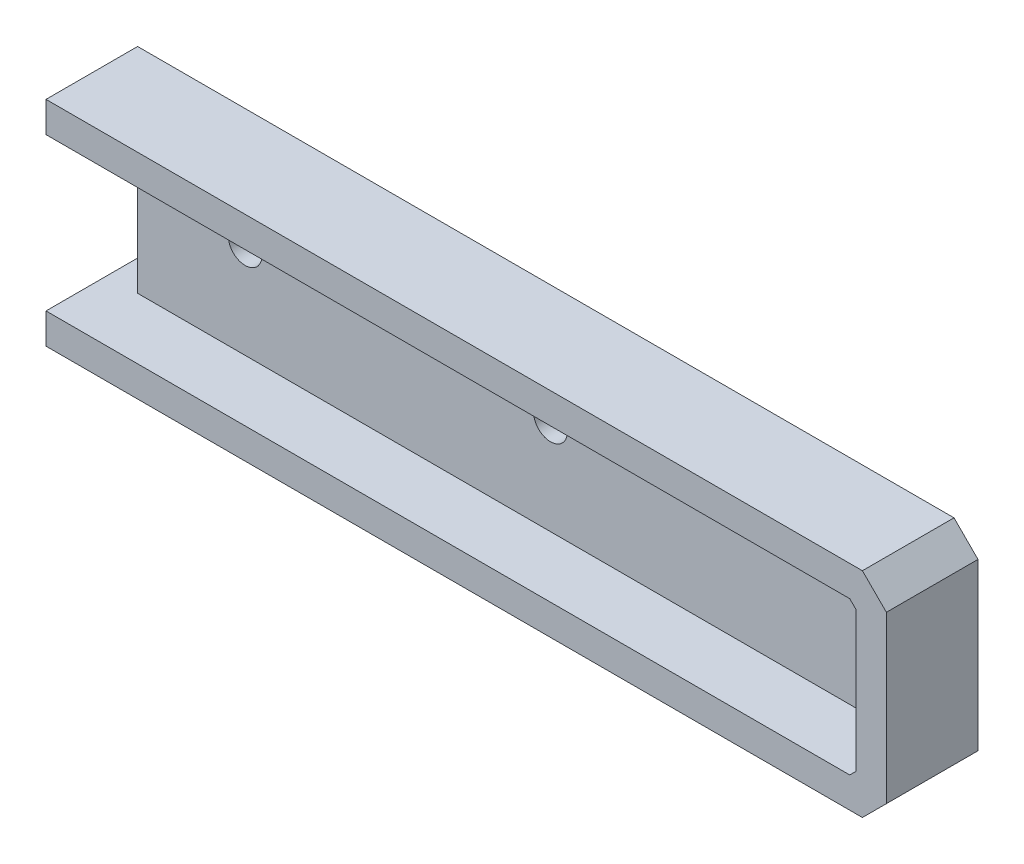
ISO-10303-21;
HEADER;
FILE_DESCRIPTION(('STEP AP214'),'2;1');
FILE_NAME('part.step','',(''),(''),'','','');
FILE_SCHEMA(('AUTOMOTIVE_DESIGN { 1 0 10303 214 1 1 1 1 }'));
ENDSEC;
DATA;
#1=APPLICATION_CONTEXT('core data for automotive mechanical design processes');
#2=APPLICATION_PROTOCOL_DEFINITION('international standard','automotive_design',2000,#1);
#3=PRODUCT_CONTEXT('',#1,'mechanical');
#4=PRODUCT('Part','Part','',(#3));
#5=PRODUCT_RELATED_PRODUCT_CATEGORY('part','',(#4));
#6=PRODUCT_DEFINITION_FORMATION('','',#4);
#7=PRODUCT_DEFINITION_CONTEXT('part definition',#1,'design');
#8=PRODUCT_DEFINITION('design','',#6,#7);
#9=PRODUCT_DEFINITION_SHAPE('','',#8);
#10=(LENGTH_UNIT() NAMED_UNIT(*) SI_UNIT(.MILLI.,.METRE.));
#11=(NAMED_UNIT(*) PLANE_ANGLE_UNIT() SI_UNIT($,.RADIAN.));
#12=(NAMED_UNIT(*) SI_UNIT($,.STERADIAN.) SOLID_ANGLE_UNIT());
#13=UNCERTAINTY_MEASURE_WITH_UNIT(LENGTH_MEASURE(1.E-05),#10,'distance_accuracy_value','');
#14=(GEOMETRIC_REPRESENTATION_CONTEXT(3) GLOBAL_UNCERTAINTY_ASSIGNED_CONTEXT((#13)) GLOBAL_UNIT_ASSIGNED_CONTEXT((#10,
#11,#12)) REPRESENTATION_CONTEXT('',''));
#15=CARTESIAN_POINT('',(0.,0.,0.));
#16=DIRECTION('',(0.,0.,1.));
#17=DIRECTION('',(1.,0.,0.));
#18=AXIS2_PLACEMENT_3D('',#15,#16,#17);
#19=CARTESIAN_POINT('',(0.,0.,5.));
#20=DIRECTION('',(0.,0.,-1.));
#21=DIRECTION('',(-1.,0.,0.));
#22=AXIS2_PLACEMENT_3D('',#19,#20,#21);
#23=PLANE('',#22);
#24=DIRECTION('',(-1.,0.,0.));
#25=VECTOR('',#24,1.);
#26=CARTESIAN_POINT('',(72.3909080624026,0.,5.));
#27=LINE('',#26,#25);
#28=CARTESIAN_POINT('',(199.,0.,5.));
#29=VERTEX_POINT('',#28);
#30=CARTESIAN_POINT('',(72.3909080624026,0.,5.));
#31=VERTEX_POINT('',#30);
#32=EDGE_CURVE('E245',#29,#31,#27,.T.);
#33=ORIENTED_EDGE('',*,*,#32,.T.);
#34=DIRECTION('',(0.,-1.,0.));
#35=VECTOR('',#34,1.);
#36=CARTESIAN_POINT('',(72.3909080624026,0.,5.));
#37=LINE('',#36,#35);
#38=CARTESIAN_POINT('',(72.3909080624026,-25.,5.));
#39=VERTEX_POINT('',#38);
#40=EDGE_CURVE('E247',#31,#39,#37,.T.);
#41=ORIENTED_EDGE('',*,*,#40,.T.);
#42=DIRECTION('',(1.,0.,0.));
#43=VECTOR('',#42,1.);
#44=CARTESIAN_POINT('',(195.,-25.,5.));
#45=LINE('',#44,#43);
#46=CARTESIAN_POINT('',(199.,-25.,5.));
#47=VERTEX_POINT('',#46);
#48=EDGE_CURVE('E249',#39,#47,#45,.T.);
#49=ORIENTED_EDGE('',*,*,#48,.T.);
#50=DIRECTION('',(0.707106781186547,0.707106781186547,0.));
#51=VECTOR('',#50,1.);
#52=CARTESIAN_POINT('',(199.,-25.,5.));
#53=LINE('',#52,#51);
#54=CARTESIAN_POINT('',(200.,-24.,5.));
#55=VERTEX_POINT('',#54);
#56=EDGE_CURVE('E148',#47,#55,#53,.T.);
#57=ORIENTED_EDGE('',*,*,#56,.T.);
#58=DIRECTION('',(0.,1.,0.));
#59=VECTOR('',#58,1.);
#60=CARTESIAN_POINT('',(200.,-1.00000000000004,5.));
#61=LINE('',#60,#59);
#62=CARTESIAN_POINT('',(200.,-1.00000000000004,5.));
#63=VERTEX_POINT('',#62);
#64=EDGE_CURVE('E252',#55,#63,#61,.T.);
#65=ORIENTED_EDGE('',*,*,#64,.T.);
#66=DIRECTION('',(-0.707106781186547,0.707106781186548,0.));
#67=VECTOR('',#66,1.);
#68=CARTESIAN_POINT('',(199.,0.,5.));
#69=LINE('',#68,#67);
#70=EDGE_CURVE('E49',#63,#29,#69,.T.);
#71=ORIENTED_EDGE('',*,*,#70,.T.);
#72=EDGE_LOOP('',(#33,#41,#49,#57,#65,#71));
#73=FACE_BOUND('',#72,.T.);
#74=CARTESIAN_POINT('',(90.0000000000027,-9.49999999999997,5.));
#75=DIRECTION('',(0.,0.,1.));
#76=DIRECTION('',(-1.,0.,0.));
#77=AXIS2_PLACEMENT_3D('',#74,#75,#76);
#78=CIRCLE('',#77,2.75000000000001);
#79=CARTESIAN_POINT('',(87.2500000000027,-9.49999999999997,5.));
#80=VERTEX_POINT('',#79);
#81=EDGE_CURVE('E239',#80,#80,#78,.T.);
#82=ORIENTED_EDGE('',*,*,#81,.F.);
#83=EDGE_LOOP('',(#82));
#84=FACE_BOUND('',#83,.T.);
#85=CARTESIAN_POINT('',(140.,-9.49999999999997,5.));
#86=DIRECTION('',(0.,0.,1.));
#87=DIRECTION('',(-1.,0.,0.));
#88=AXIS2_PLACEMENT_3D('',#85,#86,#87);
#89=CIRCLE('',#88,2.75000000000001);
#90=CARTESIAN_POINT('',(137.25,-9.49999999999997,5.));
#91=VERTEX_POINT('',#90);
#92=EDGE_CURVE('E233',#91,#91,#89,.T.);
#93=ORIENTED_EDGE('',*,*,#92,.F.);
#94=EDGE_LOOP('',(#93));
#95=FACE_BOUND('',#94,.T.);
#96=ADVANCED_FACE('F33',(#73,#84,#95),#23,.F.);
#97=CARTESIAN_POINT('',(0.,0.,0.));
#98=DIRECTION('',(0.,0.,-1.));
#99=DIRECTION('',(-1.,0.,0.));
#100=AXIS2_PLACEMENT_3D('',#97,#98,#99);
#101=PLANE('',#100);
#102=CARTESIAN_POINT('',(90.0000000000027,-9.49999999999997,0.));
#103=DIRECTION('',(0.,0.,1.));
#104=DIRECTION('',(-1.,0.,0.));
#105=AXIS2_PLACEMENT_3D('',#102,#103,#104);
#106=CIRCLE('',#105,2.75000000000001);
#107=CARTESIAN_POINT('',(87.2500000000027,-9.49999999999997,0.));
#108=VERTEX_POINT('',#107);
#109=EDGE_CURVE('E236',#108,#108,#106,.T.);
#110=ORIENTED_EDGE('',*,*,#109,.T.);
#111=EDGE_LOOP('',(#110));
#112=FACE_BOUND('',#111,.T.);
#113=DIRECTION('',(0.,-1.,0.));
#114=VECTOR('',#113,1.);
#115=CARTESIAN_POINT('',(72.3909080624026,0.,0.));
#116=LINE('',#115,#114);
#117=CARTESIAN_POINT('',(72.3909080624026,0.,0.));
#118=VERTEX_POINT('',#117);
#119=CARTESIAN_POINT('',(72.3909080624026,-25.,0.));
#120=VERTEX_POINT('',#119);
#121=EDGE_CURVE('E242',#118,#120,#116,.T.);
#122=ORIENTED_EDGE('',*,*,#121,.F.);
#123=DIRECTION('',(-1.,0.,0.));
#124=VECTOR('',#123,1.);
#125=CARTESIAN_POINT('',(72.3909080624026,0.,0.));
#126=LINE('',#125,#124);
#127=CARTESIAN_POINT('',(67.3909080624026,0.,0.));
#128=VERTEX_POINT('',#127);
#129=EDGE_CURVE('E187',#118,#128,#126,.T.);
#130=ORIENTED_EDGE('',*,*,#129,.T.);
#131=DIRECTION('',(0.,1.,0.));
#132=VECTOR('',#131,1.);
#133=CARTESIAN_POINT('',(67.3909080624026,0.,0.));
#134=LINE('',#133,#132);
#135=CARTESIAN_POINT('',(67.3909080624026,5.00000000000005,0.));
#136=VERTEX_POINT('',#135);
#137=EDGE_CURVE('E189',#128,#136,#134,.T.);
#138=ORIENTED_EDGE('',*,*,#137,.T.);
#139=DIRECTION('',(1.,0.,0.));
#140=VECTOR('',#139,1.);
#141=CARTESIAN_POINT('',(67.3909080624026,5.00000000000005,0.));
#142=LINE('',#141,#140);
#143=CARTESIAN_POINT('',(201.071067811865,5.00000000000002,0.));
#144=VERTEX_POINT('',#143);
#145=EDGE_CURVE('E192',#136,#144,#142,.T.);
#146=ORIENTED_EDGE('',*,*,#145,.T.);
#147=DIRECTION('',(0.707106781186547,-0.707106781186548,0.));
#148=VECTOR('',#147,1.);
#149=CARTESIAN_POINT('',(201.071067811865,5.00000000000002,0.));
#150=LINE('',#149,#148);
#151=CARTESIAN_POINT('',(205.,1.07106781186542,0.));
#152=VERTEX_POINT('',#151);
#153=EDGE_CURVE('E195',#144,#152,#150,.T.);
#154=ORIENTED_EDGE('',*,*,#153,.T.);
#155=DIRECTION('',(0.,-1.,0.));
#156=VECTOR('',#155,1.);
#157=CARTESIAN_POINT('',(205.,1.07106781186542,0.));
#158=LINE('',#157,#156);
#159=CARTESIAN_POINT('',(205.,-26.0710678118654,0.));
#160=VERTEX_POINT('',#159);
#161=EDGE_CURVE('E198',#152,#160,#158,.T.);
#162=ORIENTED_EDGE('',*,*,#161,.T.);
#163=DIRECTION('',(-0.707106781186547,-0.707106781186548,0.));
#164=VECTOR('',#163,1.);
#165=CARTESIAN_POINT('',(205.,-26.0710678118654,0.));
#166=LINE('',#165,#164);
#167=CARTESIAN_POINT('',(201.071067811865,-30.,0.));
#168=VERTEX_POINT('',#167);
#169=EDGE_CURVE('E201',#160,#168,#166,.T.);
#170=ORIENTED_EDGE('',*,*,#169,.T.);
#171=DIRECTION('',(-1.,0.,0.));
#172=VECTOR('',#171,1.);
#173=CARTESIAN_POINT('',(201.071067811865,-30.,0.));
#174=LINE('',#173,#172);
#175=CARTESIAN_POINT('',(67.3909080624026,-30.,0.));
#176=VERTEX_POINT('',#175);
#177=EDGE_CURVE('E204',#168,#176,#174,.T.);
#178=ORIENTED_EDGE('',*,*,#177,.T.);
#179=DIRECTION('',(0.,1.,0.));
#180=VECTOR('',#179,1.);
#181=CARTESIAN_POINT('',(67.3909080624026,-30.,0.));
#182=LINE('',#181,#180);
#183=CARTESIAN_POINT('',(67.3909080624026,-25.,0.));
#184=VERTEX_POINT('',#183);
#185=EDGE_CURVE('E141',#176,#184,#182,.T.);
#186=ORIENTED_EDGE('',*,*,#185,.T.);
#187=DIRECTION('',(1.,0.,0.));
#188=VECTOR('',#187,1.);
#189=CARTESIAN_POINT('',(199.,-25.,0.));
#190=LINE('',#189,#188);
#191=EDGE_CURVE('E184',#184,#120,#190,.T.);
#192=ORIENTED_EDGE('',*,*,#191,.T.);
#193=EDGE_LOOP('',(#122,#130,#138,#146,#154,#162,#170,#178,#186,#192));
#194=FACE_BOUND('',#193,.T.);
#195=CARTESIAN_POINT('',(140.,-9.49999999999997,0.));
#196=DIRECTION('',(0.,0.,1.));
#197=DIRECTION('',(-1.,0.,0.));
#198=AXIS2_PLACEMENT_3D('',#195,#196,#197);
#199=CIRCLE('',#198,2.75000000000001);
#200=CARTESIAN_POINT('',(137.25,-9.49999999999997,0.));
#201=VERTEX_POINT('',#200);
#202=EDGE_CURVE('E210',#201,#201,#199,.T.);
#203=ORIENTED_EDGE('',*,*,#202,.T.);
#204=EDGE_LOOP('',(#203));
#205=FACE_BOUND('',#204,.T.);
#206=ADVANCED_FACE('F261',(#112,#194,#205),#101,.T.);
#207=CARTESIAN_POINT('',(72.3909080624026,0.,5.));
#208=DIRECTION('',(1.,0.,0.));
#209=DIRECTION('',(0.,0.,-1.));
#210=AXIS2_PLACEMENT_3D('',#207,#208,#209);
#211=PLANE('',#210);
#212=ORIENTED_EDGE('',*,*,#121,.T.);
#213=DIRECTION('',(0.,0.,-1.));
#214=VECTOR('',#213,1.);
#215=CARTESIAN_POINT('',(72.3909080624026,-25.,5.));
#216=LINE('',#215,#214);
#217=EDGE_CURVE('E42',#39,#120,#216,.T.);
#218=ORIENTED_EDGE('',*,*,#217,.F.);
#219=ORIENTED_EDGE('',*,*,#40,.F.);
#220=DIRECTION('',(0.,0.,-1.));
#221=VECTOR('',#220,1.);
#222=CARTESIAN_POINT('',(72.3909080624026,0.,5.));
#223=LINE('',#222,#221);
#224=EDGE_CURVE('E11',#31,#118,#223,.T.);
#225=ORIENTED_EDGE('',*,*,#224,.T.);
#226=EDGE_LOOP('',(#212,#218,#219,#225));
#227=FACE_BOUND('',#226,.T.);
#228=ADVANCED_FACE('F35',(#227),#211,.F.);
#229=CARTESIAN_POINT('',(90.0000000000027,-9.49999999999997,5.));
#230=DIRECTION('',(0.,0.,-1.));
#231=DIRECTION('',(-1.,0.,0.));
#232=AXIS2_PLACEMENT_3D('',#229,#230,#231);
#233=CYLINDRICAL_SURFACE('',#232,2.75000000000001);
#234=ORIENTED_EDGE('',*,*,#81,.T.);
#235=EDGE_LOOP('',(#234));
#236=FACE_BOUND('',#235,.T.);
#237=ORIENTED_EDGE('',*,*,#109,.F.);
#238=EDGE_LOOP('',(#237));
#239=FACE_BOUND('',#238,.T.);
#240=ADVANCED_FACE('F302',(#236,#239),#233,.F.);
#241=CARTESIAN_POINT('',(140.,-9.49999999999997,5.));
#242=DIRECTION('',(0.,0.,-1.));
#243=DIRECTION('',(-1.,0.,0.));
#244=AXIS2_PLACEMENT_3D('',#241,#242,#243);
#245=CYLINDRICAL_SURFACE('',#244,2.75000000000001);
#246=ORIENTED_EDGE('',*,*,#92,.T.);
#247=EDGE_LOOP('',(#246));
#248=FACE_BOUND('',#247,.T.);
#249=ORIENTED_EDGE('',*,*,#202,.F.);
#250=EDGE_LOOP('',(#249));
#251=FACE_BOUND('',#250,.T.);
#252=ADVANCED_FACE('F307',(#248,#251),#245,.F.);
#253=CARTESIAN_POINT('',(199.,-25.,15.));
#254=DIRECTION('',(0.,1.,0.));
#255=DIRECTION('',(-1.,0.,0.));
#256=AXIS2_PLACEMENT_3D('',#253,#254,#255);
#257=PLANE('',#256);
#258=ORIENTED_EDGE('',*,*,#48,.F.);
#259=ORIENTED_EDGE('',*,*,#217,.T.);
#260=ORIENTED_EDGE('',*,*,#191,.F.);
#261=DIRECTION('',(0.,0.,-1.));
#262=VECTOR('',#261,1.);
#263=CARTESIAN_POINT('',(67.3909080624026,-25.,15.));
#264=LINE('',#263,#262);
#265=CARTESIAN_POINT('',(67.3909080624026,-25.,15.));
#266=VERTEX_POINT('',#265);
#267=EDGE_CURVE('E135',#266,#184,#264,.T.);
#268=ORIENTED_EDGE('',*,*,#267,.F.);
#269=DIRECTION('',(1.,0.,0.));
#270=VECTOR('',#269,1.);
#271=CARTESIAN_POINT('',(72.3909080624026,-25.,15.));
#272=LINE('',#271,#270);
#273=CARTESIAN_POINT('',(199.,-25.,15.));
#274=VERTEX_POINT('',#273);
#275=EDGE_CURVE('E129',#266,#274,#272,.T.);
#276=ORIENTED_EDGE('',*,*,#275,.T.);
#277=DIRECTION('',(0.,0.,-1.));
#278=VECTOR('',#277,1.);
#279=CARTESIAN_POINT('',(199.,-25.,15.));
#280=LINE('',#279,#278);
#281=EDGE_CURVE('E133',#274,#47,#280,.T.);
#282=ORIENTED_EDGE('',*,*,#281,.T.);
#283=EDGE_LOOP('',(#258,#259,#260,#268,#276,#282));
#284=FACE_BOUND('',#283,.T.);
#285=ADVANCED_FACE('F132',(#284),#257,.T.);
#286=CARTESIAN_POINT('',(200.,-24.,15.));
#287=DIRECTION('',(-0.707106781186547,0.707106781186547,0.));
#288=DIRECTION('',(-0.707106781186548,-0.707106781186548,0.));
#289=AXIS2_PLACEMENT_3D('',#286,#287,#288);
#290=PLANE('',#289);
#291=ORIENTED_EDGE('',*,*,#56,.F.);
#292=ORIENTED_EDGE('',*,*,#281,.F.);
#293=DIRECTION('',(0.707106781186547,0.707106781186547,0.));
#294=VECTOR('',#293,1.);
#295=CARTESIAN_POINT('',(200.,-24.,15.));
#296=LINE('',#295,#294);
#297=CARTESIAN_POINT('',(200.,-24.,15.));
#298=VERTEX_POINT('',#297);
#299=EDGE_CURVE('E140',#274,#298,#296,.T.);
#300=ORIENTED_EDGE('',*,*,#299,.T.);
#301=DIRECTION('',(0.,0.,-1.));
#302=VECTOR('',#301,1.);
#303=CARTESIAN_POINT('',(200.,-24.,15.));
#304=LINE('',#303,#302);
#305=EDGE_CURVE('E149',#298,#55,#304,.T.);
#306=ORIENTED_EDGE('',*,*,#305,.T.);
#307=EDGE_LOOP('',(#291,#292,#300,#306));
#308=FACE_BOUND('',#307,.T.);
#309=ADVANCED_FACE('F146',(#308),#290,.T.);
#310=CARTESIAN_POINT('',(72.3909080624026,0.,15.));
#311=DIRECTION('',(0.,-1.,0.));
#312=DIRECTION('',(1.,0.,0.));
#313=AXIS2_PLACEMENT_3D('',#310,#311,#312);
#314=PLANE('',#313);
#315=ORIENTED_EDGE('',*,*,#32,.F.);
#316=DIRECTION('',(0.,0.,-1.));
#317=VECTOR('',#316,1.);
#318=CARTESIAN_POINT('',(199.,0.,15.));
#319=LINE('',#318,#317);
#320=CARTESIAN_POINT('',(199.,0.,15.));
#321=VERTEX_POINT('',#320);
#322=EDGE_CURVE('E226',#321,#29,#319,.T.);
#323=ORIENTED_EDGE('',*,*,#322,.F.);
#324=DIRECTION('',(-1.,0.,0.));
#325=VECTOR('',#324,1.);
#326=CARTESIAN_POINT('',(72.3909080624026,0.,15.));
#327=LINE('',#326,#325);
#328=CARTESIAN_POINT('',(67.3909080624026,0.,15.));
#329=VERTEX_POINT('',#328);
#330=EDGE_CURVE('E163',#321,#329,#327,.T.);
#331=ORIENTED_EDGE('',*,*,#330,.T.);
#332=DIRECTION('',(0.,0.,-1.));
#333=VECTOR('',#332,1.);
#334=CARTESIAN_POINT('',(67.3909080624026,0.,15.));
#335=LINE('',#334,#333);
#336=EDGE_CURVE('E223',#329,#128,#335,.T.);
#337=ORIENTED_EDGE('',*,*,#336,.T.);
#338=ORIENTED_EDGE('',*,*,#129,.F.);
#339=ORIENTED_EDGE('',*,*,#224,.F.);
#340=EDGE_LOOP('',(#315,#323,#331,#337,#338,#339));
#341=FACE_BOUND('',#340,.T.);
#342=ADVANCED_FACE('F293',(#341),#314,.T.);
#343=CARTESIAN_POINT('',(200.,-1.00000000000004,15.));
#344=DIRECTION('',(-1.,0.,0.));
#345=DIRECTION('',(0.,0.,1.));
#346=AXIS2_PLACEMENT_3D('',#343,#344,#345);
#347=PLANE('',#346);
#348=ORIENTED_EDGE('',*,*,#64,.F.);
#349=ORIENTED_EDGE('',*,*,#305,.F.);
#350=DIRECTION('',(0.,1.,0.));
#351=VECTOR('',#350,1.);
#352=CARTESIAN_POINT('',(200.,-1.00000000000004,15.));
#353=LINE('',#352,#351);
#354=CARTESIAN_POINT('',(200.,-1.00000000000004,15.));
#355=VERTEX_POINT('',#354);
#356=EDGE_CURVE('E156',#298,#355,#353,.T.);
#357=ORIENTED_EDGE('',*,*,#356,.T.);
#358=DIRECTION('',(0.,0.,-1.));
#359=VECTOR('',#358,1.);
#360=CARTESIAN_POINT('',(200.,-1.00000000000004,15.));
#361=LINE('',#360,#359);
#362=EDGE_CURVE('E229',#355,#63,#361,.T.);
#363=ORIENTED_EDGE('',*,*,#362,.T.);
#364=EDGE_LOOP('',(#348,#349,#357,#363));
#365=FACE_BOUND('',#364,.T.);
#366=ADVANCED_FACE('F299',(#365),#347,.T.);
#367=CARTESIAN_POINT('',(199.,0.,15.));
#368=DIRECTION('',(-0.707106781186548,-0.707106781186547,0.));
#369=DIRECTION('',(0.707106781186547,-0.707106781186548,0.));
#370=AXIS2_PLACEMENT_3D('',#367,#368,#369);
#371=PLANE('',#370);
#372=ORIENTED_EDGE('',*,*,#70,.F.);
#373=ORIENTED_EDGE('',*,*,#362,.F.);
#374=DIRECTION('',(-0.707106781186547,0.707106781186548,0.));
#375=VECTOR('',#374,1.);
#376=CARTESIAN_POINT('',(199.,0.,15.));
#377=LINE('',#376,#375);
#378=EDGE_CURVE('E158',#355,#321,#377,.T.);
#379=ORIENTED_EDGE('',*,*,#378,.T.);
#380=ORIENTED_EDGE('',*,*,#322,.T.);
#381=EDGE_LOOP('',(#372,#373,#379,#380));
#382=FACE_BOUND('',#381,.T.);
#383=ADVANCED_FACE('F296',(#382),#371,.T.);
#384=CARTESIAN_POINT('',(67.3909080624026,-30.,15.));
#385=DIRECTION('',(-1.,0.,0.));
#386=DIRECTION('',(0.,0.,1.));
#387=AXIS2_PLACEMENT_3D('',#384,#385,#386);
#388=PLANE('',#387);
#389=ORIENTED_EDGE('',*,*,#185,.F.);
#390=DIRECTION('',(0.,0.,-1.));
#391=VECTOR('',#390,1.);
#392=CARTESIAN_POINT('',(67.3909080624026,-30.,15.));
#393=LINE('',#392,#391);
#394=CARTESIAN_POINT('',(67.3909080624026,-30.,15.));
#395=VERTEX_POINT('',#394);
#396=EDGE_CURVE('E211',#395,#176,#393,.T.);
#397=ORIENTED_EDGE('',*,*,#396,.F.);
#398=DIRECTION('',(0.,1.,0.));
#399=VECTOR('',#398,1.);
#400=CARTESIAN_POINT('',(67.3909080624026,-30.,15.));
#401=LINE('',#400,#399);
#402=EDGE_CURVE('E150',#395,#266,#401,.T.);
#403=ORIENTED_EDGE('',*,*,#402,.T.);
#404=ORIENTED_EDGE('',*,*,#267,.T.);
#405=EDGE_LOOP('',(#389,#397,#403,#404));
#406=FACE_BOUND('',#405,.T.);
#407=ADVANCED_FACE('F267',(#406),#388,.T.);
#408=CARTESIAN_POINT('',(201.071067811865,-30.,15.));
#409=DIRECTION('',(0.,-1.,0.));
#410=DIRECTION('',(1.,0.,0.));
#411=AXIS2_PLACEMENT_3D('',#408,#409,#410);
#412=PLANE('',#411);
#413=ORIENTED_EDGE('',*,*,#177,.F.);
#414=DIRECTION('',(0.,0.,-1.));
#415=VECTOR('',#414,1.);
#416=CARTESIAN_POINT('',(201.071067811865,-30.,15.));
#417=LINE('',#416,#415);
#418=CARTESIAN_POINT('',(201.071067811865,-30.,15.));
#419=VERTEX_POINT('',#418);
#420=EDGE_CURVE('E213',#419,#168,#417,.T.);
#421=ORIENTED_EDGE('',*,*,#420,.F.);
#422=DIRECTION('',(-1.,0.,0.));
#423=VECTOR('',#422,1.);
#424=CARTESIAN_POINT('',(201.071067811865,-30.,15.));
#425=LINE('',#424,#423);
#426=EDGE_CURVE('E180',#419,#395,#425,.T.);
#427=ORIENTED_EDGE('',*,*,#426,.T.);
#428=ORIENTED_EDGE('',*,*,#396,.T.);
#429=EDGE_LOOP('',(#413,#421,#427,#428));
#430=FACE_BOUND('',#429,.T.);
#431=ADVANCED_FACE('F339',(#430),#412,.T.);
#432=CARTESIAN_POINT('',(205.,-26.0710678118654,15.));
#433=DIRECTION('',(0.707106781186549,-0.707106781186547,0.));
#434=DIRECTION('',(0.707106781186547,0.707106781186549,0.));
#435=AXIS2_PLACEMENT_3D('',#432,#433,#434);
#436=PLANE('',#435);
#437=ORIENTED_EDGE('',*,*,#169,.F.);
#438=DIRECTION('',(0.,0.,-1.));
#439=VECTOR('',#438,1.);
#440=CARTESIAN_POINT('',(205.,-26.0710678118654,15.));
#441=LINE('',#440,#439);
#442=CARTESIAN_POINT('',(205.,-26.0710678118654,15.));
#443=VERTEX_POINT('',#442);
#444=EDGE_CURVE('E215',#443,#160,#441,.T.);
#445=ORIENTED_EDGE('',*,*,#444,.F.);
#446=DIRECTION('',(-0.707106781186547,-0.707106781186548,0.));
#447=VECTOR('',#446,1.);
#448=CARTESIAN_POINT('',(205.,-26.0710678118654,15.));
#449=LINE('',#448,#447);
#450=EDGE_CURVE('E177',#443,#419,#449,.T.);
#451=ORIENTED_EDGE('',*,*,#450,.T.);
#452=ORIENTED_EDGE('',*,*,#420,.T.);
#453=EDGE_LOOP('',(#437,#445,#451,#452));
#454=FACE_BOUND('',#453,.T.);
#455=ADVANCED_FACE('F274',(#454),#436,.T.);
#456=CARTESIAN_POINT('',(205.,1.07106781186542,15.));
#457=DIRECTION('',(1.,0.,0.));
#458=DIRECTION('',(0.,0.,-1.));
#459=AXIS2_PLACEMENT_3D('',#456,#457,#458);
#460=PLANE('',#459);
#461=ORIENTED_EDGE('',*,*,#161,.F.);
#462=DIRECTION('',(0.,0.,-1.));
#463=VECTOR('',#462,1.);
#464=CARTESIAN_POINT('',(205.,1.07106781186542,15.));
#465=LINE('',#464,#463);
#466=CARTESIAN_POINT('',(205.,1.07106781186542,15.));
#467=VERTEX_POINT('',#466);
#468=EDGE_CURVE('E217',#467,#152,#465,.T.);
#469=ORIENTED_EDGE('',*,*,#468,.F.);
#470=DIRECTION('',(0.,-1.,0.));
#471=VECTOR('',#470,1.);
#472=CARTESIAN_POINT('',(205.,1.07106781186542,15.));
#473=LINE('',#472,#471);
#474=EDGE_CURVE('E174',#467,#443,#473,.T.);
#475=ORIENTED_EDGE('',*,*,#474,.T.);
#476=ORIENTED_EDGE('',*,*,#444,.T.);
#477=EDGE_LOOP('',(#461,#469,#475,#476));
#478=FACE_BOUND('',#477,.T.);
#479=ADVANCED_FACE('F277',(#478),#460,.T.);
#480=CARTESIAN_POINT('',(201.071067811865,5.00000000000002,15.));
#481=DIRECTION('',(0.707106781186548,0.707106781186547,0.));
#482=DIRECTION('',(-0.707106781186547,0.707106781186548,0.));
#483=AXIS2_PLACEMENT_3D('',#480,#481,#482);
#484=PLANE('',#483);
#485=ORIENTED_EDGE('',*,*,#153,.F.);
#486=DIRECTION('',(0.,0.,-1.));
#487=VECTOR('',#486,1.);
#488=CARTESIAN_POINT('',(201.071067811865,5.00000000000002,15.));
#489=LINE('',#488,#487);
#490=CARTESIAN_POINT('',(201.071067811865,5.00000000000002,15.));
#491=VERTEX_POINT('',#490);
#492=EDGE_CURVE('E219',#491,#144,#489,.T.);
#493=ORIENTED_EDGE('',*,*,#492,.F.);
#494=DIRECTION('',(0.707106781186547,-0.707106781186548,0.));
#495=VECTOR('',#494,1.);
#496=CARTESIAN_POINT('',(201.071067811865,5.00000000000002,15.));
#497=LINE('',#496,#495);
#498=EDGE_CURVE('E171',#491,#467,#497,.T.);
#499=ORIENTED_EDGE('',*,*,#498,.T.);
#500=ORIENTED_EDGE('',*,*,#468,.T.);
#501=EDGE_LOOP('',(#485,#493,#499,#500));
#502=FACE_BOUND('',#501,.T.);
#503=ADVANCED_FACE('F282',(#502),#484,.T.);
#504=CARTESIAN_POINT('',(67.3909080624026,5.00000000000005,15.));
#505=DIRECTION('',(0.,1.,0.));
#506=DIRECTION('',(-1.,0.,0.));
#507=AXIS2_PLACEMENT_3D('',#504,#505,#506);
#508=PLANE('',#507);
#509=ORIENTED_EDGE('',*,*,#145,.F.);
#510=DIRECTION('',(0.,0.,-1.));
#511=VECTOR('',#510,1.);
#512=CARTESIAN_POINT('',(67.3909080624026,5.00000000000005,15.));
#513=LINE('',#512,#511);
#514=CARTESIAN_POINT('',(67.3909080624026,5.00000000000005,15.));
#515=VERTEX_POINT('',#514);
#516=EDGE_CURVE('E221',#515,#136,#513,.T.);
#517=ORIENTED_EDGE('',*,*,#516,.F.);
#518=DIRECTION('',(1.,0.,0.));
#519=VECTOR('',#518,1.);
#520=CARTESIAN_POINT('',(67.3909080624026,5.00000000000005,15.));
#521=LINE('',#520,#519);
#522=EDGE_CURVE('E168',#515,#491,#521,.T.);
#523=ORIENTED_EDGE('',*,*,#522,.T.);
#524=ORIENTED_EDGE('',*,*,#492,.T.);
#525=EDGE_LOOP('',(#509,#517,#523,#524));
#526=FACE_BOUND('',#525,.T.);
#527=ADVANCED_FACE('F285',(#526),#508,.T.);
#528=CARTESIAN_POINT('',(67.3909080624026,0.,15.));
#529=DIRECTION('',(-1.,0.,0.));
#530=DIRECTION('',(0.,0.,1.));
#531=AXIS2_PLACEMENT_3D('',#528,#529,#530);
#532=PLANE('',#531);
#533=ORIENTED_EDGE('',*,*,#137,.F.);
#534=ORIENTED_EDGE('',*,*,#336,.F.);
#535=DIRECTION('',(0.,1.,0.));
#536=VECTOR('',#535,1.);
#537=CARTESIAN_POINT('',(67.3909080624026,0.,15.));
#538=LINE('',#537,#536);
#539=EDGE_CURVE('E165',#329,#515,#538,.T.);
#540=ORIENTED_EDGE('',*,*,#539,.T.);
#541=ORIENTED_EDGE('',*,*,#516,.T.);
#542=EDGE_LOOP('',(#533,#534,#540,#541));
#543=FACE_BOUND('',#542,.T.);
#544=ADVANCED_FACE('F291',(#543),#532,.T.);
#545=CARTESIAN_POINT('',(0.,0.,15.));
#546=DIRECTION('',(0.,0.,-1.));
#547=DIRECTION('',(-1.,0.,0.));
#548=AXIS2_PLACEMENT_3D('',#545,#546,#547);
#549=PLANE('',#548);
#550=ORIENTED_EDGE('',*,*,#275,.F.);
#551=ORIENTED_EDGE('',*,*,#402,.F.);
#552=ORIENTED_EDGE('',*,*,#426,.F.);
#553=ORIENTED_EDGE('',*,*,#450,.F.);
#554=ORIENTED_EDGE('',*,*,#474,.F.);
#555=ORIENTED_EDGE('',*,*,#498,.F.);
#556=ORIENTED_EDGE('',*,*,#522,.F.);
#557=ORIENTED_EDGE('',*,*,#539,.F.);
#558=ORIENTED_EDGE('',*,*,#330,.F.);
#559=ORIENTED_EDGE('',*,*,#378,.F.);
#560=ORIENTED_EDGE('',*,*,#356,.F.);
#561=ORIENTED_EDGE('',*,*,#299,.F.);
#562=EDGE_LOOP('',(#550,#551,#552,#553,#554,#555,#556,#557,#558,#559,#560,#561));
#563=FACE_BOUND('',#562,.T.);
#564=ADVANCED_FACE('F153',(#563),#549,.F.);
#565=CLOSED_SHELL('',(#96,#206,#228,#240,#252,#285,#309,#342,#366,#383,#407,#431,#455,#479,#503,
#527,#544,#564));
#566=MANIFOLD_SOLID_BREP('B2',#565);
#567=ADVANCED_BREP_SHAPE_REPRESENTATION('',(#18,#566),#14);
#568=SHAPE_DEFINITION_REPRESENTATION(#9,#567);
ENDSEC;
END-ISO-10303-21;
